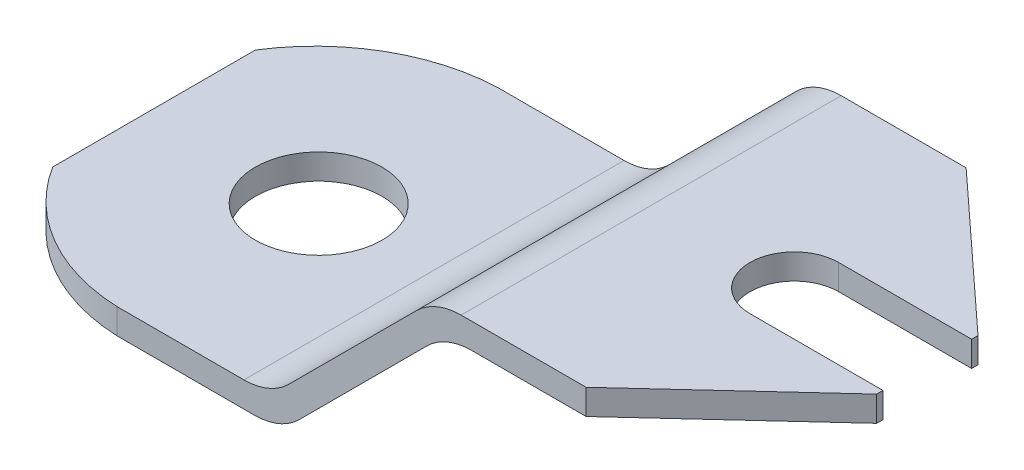
ISO-10303-21;
HEADER;
FILE_DESCRIPTION(('STEP AP214'),'2;1');
FILE_NAME('part.step','',(''),(''),'','','');
FILE_SCHEMA(('AUTOMOTIVE_DESIGN { 1 0 10303 214 1 1 1 1 }'));
ENDSEC;
DATA;
#1=APPLICATION_CONTEXT('core data for automotive mechanical design processes');
#2=APPLICATION_PROTOCOL_DEFINITION('international standard','automotive_design',2000,#1);
#3=PRODUCT_CONTEXT('',#1,'mechanical');
#4=PRODUCT('Part','Part','',(#3));
#5=PRODUCT_RELATED_PRODUCT_CATEGORY('part','',(#4));
#6=PRODUCT_DEFINITION_FORMATION('','',#4);
#7=PRODUCT_DEFINITION_CONTEXT('part definition',#1,'design');
#8=PRODUCT_DEFINITION('design','',#6,#7);
#9=PRODUCT_DEFINITION_SHAPE('','',#8);
#10=(LENGTH_UNIT() NAMED_UNIT(*) SI_UNIT(.MILLI.,.METRE.));
#11=(NAMED_UNIT(*) PLANE_ANGLE_UNIT() SI_UNIT($,.RADIAN.));
#12=(NAMED_UNIT(*) SI_UNIT($,.STERADIAN.) SOLID_ANGLE_UNIT());
#13=UNCERTAINTY_MEASURE_WITH_UNIT(LENGTH_MEASURE(1.E-05),#10,'distance_accuracy_value','');
#14=(GEOMETRIC_REPRESENTATION_CONTEXT(3) GLOBAL_UNCERTAINTY_ASSIGNED_CONTEXT((#13)) GLOBAL_UNIT_ASSIGNED_CONTEXT((#10,
#11,#12)) REPRESENTATION_CONTEXT('',''));
#15=CARTESIAN_POINT('',(0.,0.,0.));
#16=DIRECTION('',(0.,0.,1.));
#17=DIRECTION('',(1.,0.,0.));
#18=AXIS2_PLACEMENT_3D('',#15,#16,#17);
#19=CARTESIAN_POINT('',(0.,0.,30.));
#20=DIRECTION('',(0.,1.,0.));
#21=DIRECTION('',(0.,0.,1.));
#22=AXIS2_PLACEMENT_3D('',#19,#20,#21);
#23=PLANE('',#22);
#24=CARTESIAN_POINT('',(26.,0.,0.));
#25=DIRECTION('',(0.,1.,0.));
#26=DIRECTION('',(0.,0.,1.));
#27=AXIS2_PLACEMENT_3D('',#24,#25,#26);
#28=CIRCLE('',#27,10.);
#29=CARTESIAN_POINT('',(26.,0.,10.));
#30=VERTEX_POINT('',#29);
#31=EDGE_CURVE('E209',#30,#30,#28,.F.);
#32=ORIENTED_EDGE('',*,*,#31,.F.);
#33=EDGE_LOOP('',(#32));
#34=FACE_BOUND('',#33,.T.);
#35=DIRECTION('',(1.,0.,0.));
#36=VECTOR('',#35,1.);
#37=CARTESIAN_POINT('',(0.,0.,-30.));
#38=LINE('',#37,#36);
#39=CARTESIAN_POINT('',(24.1715728752538,0.,-30.));
#40=VERTEX_POINT('',#39);
#41=CARTESIAN_POINT('',(45.857864376269,0.,-30.));
#42=VERTEX_POINT('',#41);
#43=EDGE_CURVE('E266',#40,#42,#38,.T.);
#44=ORIENTED_EDGE('',*,*,#43,.T.);
#45=DIRECTION('',(0.,0.,-1.));
#46=VECTOR('',#45,1.);
#47=CARTESIAN_POINT('',(45.857864376269,0.,30.));
#48=LINE('',#47,#46);
#49=CARTESIAN_POINT('',(45.857864376269,0.,30.));
#50=VERTEX_POINT('',#49);
#51=EDGE_CURVE('E54',#42,#50,#48,.F.);
#52=ORIENTED_EDGE('',*,*,#51,.T.);
#53=DIRECTION('',(1.,0.,0.));
#54=VECTOR('',#53,1.);
#55=CARTESIAN_POINT('',(0.,0.,30.));
#56=LINE('',#55,#54);
#57=CARTESIAN_POINT('',(24.1715728752538,0.,30.));
#58=VERTEX_POINT('',#57);
#59=EDGE_CURVE('E191',#58,#50,#56,.T.);
#60=ORIENTED_EDGE('',*,*,#59,.F.);
#61=CARTESIAN_POINT('',(25.3928167857688,0.,0.0248675847623649));
#62=DIRECTION('',(0.,1.,0.));
#63=DIRECTION('',(0.,0.,-1.));
#64=AXIS2_PLACEMENT_3D('',#61,#62,#63);
#65=CIRCLE('',#64,30.);
#66=CARTESIAN_POINT('',(0.,0.,16.));
#67=VERTEX_POINT('',#66);
#68=EDGE_CURVE('E180',#67,#58,#65,.T.);
#69=ORIENTED_EDGE('',*,*,#68,.F.);
#70=DIRECTION('',(0.,0.,-1.));
#71=VECTOR('',#70,1.);
#72=CARTESIAN_POINT('',(0.,0.,30.));
#73=LINE('',#72,#71);
#74=CARTESIAN_POINT('',(0.,0.,-16.));
#75=VERTEX_POINT('',#74);
#76=EDGE_CURVE('E189',#67,#75,#73,.T.);
#77=ORIENTED_EDGE('',*,*,#76,.T.);
#78=CARTESIAN_POINT('',(25.3928167857688,0.,-0.0248675847623649));
#79=DIRECTION('',(0.,-1.,0.));
#80=DIRECTION('',(0.,0.,1.));
#81=AXIS2_PLACEMENT_3D('',#78,#79,#80);
#82=CIRCLE('',#81,30.);
#83=EDGE_CURVE('E399',#75,#40,#82,.T.);
#84=ORIENTED_EDGE('',*,*,#83,.T.);
#85=EDGE_LOOP('',(#44,#52,#60,#69,#77,#84));
#86=FACE_BOUND('',#85,.T.);
#87=ADVANCED_FACE('F39',(#34,#86),#23,.F.);
#88=CARTESIAN_POINT('',(0.,4.,30.));
#89=DIRECTION('',(0.,-1.,0.));
#90=DIRECTION('',(0.,0.,-1.));
#91=AXIS2_PLACEMENT_3D('',#88,#89,#90);
#92=PLANE('',#91);
#93=CARTESIAN_POINT('',(26.,4.,0.));
#94=DIRECTION('',(0.,-1.,0.));
#95=DIRECTION('',(0.,0.,-1.));
#96=AXIS2_PLACEMENT_3D('',#93,#94,#95);
#97=CIRCLE('',#96,10.);
#98=CARTESIAN_POINT('',(26.,4.,-10.));
#99=VERTEX_POINT('',#98);
#100=EDGE_CURVE('E207',#99,#99,#97,.F.);
#101=ORIENTED_EDGE('',*,*,#100,.F.);
#102=EDGE_LOOP('',(#101));
#103=FACE_BOUND('',#102,.T.);
#104=DIRECTION('',(-1.,0.,0.));
#105=VECTOR('',#104,1.);
#106=CARTESIAN_POINT('',(0.,4.,30.));
#107=LINE('',#106,#105);
#108=CARTESIAN_POINT('',(44.2010101267767,4.,30.));
#109=VERTEX_POINT('',#108);
#110=CARTESIAN_POINT('',(24.1715728752538,4.,30.));
#111=VERTEX_POINT('',#110);
#112=EDGE_CURVE('E291',#109,#111,#107,.T.);
#113=ORIENTED_EDGE('',*,*,#112,.F.);
#114=DIRECTION('',(0.,0.,-1.));
#115=VECTOR('',#114,1.);
#116=CARTESIAN_POINT('',(44.2010101267767,4.,-30.));
#117=LINE('',#116,#115);
#118=CARTESIAN_POINT('',(44.2010101267767,4.,-30.));
#119=VERTEX_POINT('',#118);
#120=EDGE_CURVE('E221',#109,#119,#117,.T.);
#121=ORIENTED_EDGE('',*,*,#120,.T.);
#122=DIRECTION('',(-1.,0.,0.));
#123=VECTOR('',#122,1.);
#124=CARTESIAN_POINT('',(0.,4.,-30.));
#125=LINE('',#124,#123);
#126=CARTESIAN_POINT('',(24.1715728752538,4.,-30.));
#127=VERTEX_POINT('',#126);
#128=EDGE_CURVE('E301',#119,#127,#125,.T.);
#129=ORIENTED_EDGE('',*,*,#128,.T.);
#130=CARTESIAN_POINT('',(25.3928167857688,4.,-0.0248675847623649));
#131=DIRECTION('',(0.,-1.,0.));
#132=DIRECTION('',(0.,0.,-1.));
#133=AXIS2_PLACEMENT_3D('',#130,#131,#132);
#134=CIRCLE('',#133,30.);
#135=CARTESIAN_POINT('',(0.,4.,-16.));
#136=VERTEX_POINT('',#135);
#137=EDGE_CURVE('E216',#136,#127,#134,.T.);
#138=ORIENTED_EDGE('',*,*,#137,.F.);
#139=DIRECTION('',(0.,0.,-1.));
#140=VECTOR('',#139,1.);
#141=CARTESIAN_POINT('',(0.,4.,30.));
#142=LINE('',#141,#140);
#143=CARTESIAN_POINT('',(0.,4.,16.));
#144=VERTEX_POINT('',#143);
#145=EDGE_CURVE('E293',#144,#136,#142,.T.);
#146=ORIENTED_EDGE('',*,*,#145,.F.);
#147=CARTESIAN_POINT('',(25.3928167857688,4.,0.0248675847623649));
#148=DIRECTION('',(0.,-1.,0.));
#149=DIRECTION('',(0.,0.,-1.));
#150=AXIS2_PLACEMENT_3D('',#147,#148,#149);
#151=CIRCLE('',#150,30.);
#152=EDGE_CURVE('E183',#144,#111,#151,.F.);
#153=ORIENTED_EDGE('',*,*,#152,.T.);
#154=EDGE_LOOP('',(#113,#121,#129,#138,#146,#153));
#155=FACE_BOUND('',#154,.T.);
#156=ADVANCED_FACE('F360',(#103,#155),#92,.F.);
#157=CARTESIAN_POINT('',(0.,0.,-30.));
#158=DIRECTION('',(0.,0.,-1.));
#159=DIRECTION('',(-1.,0.,0.));
#160=AXIS2_PLACEMENT_3D('',#157,#158,#159);
#161=PLANE('',#160);
#162=DIRECTION('',(0.707106781186547,0.707106781186548,0.));
#163=VECTOR('',#162,1.);
#164=CARTESIAN_POINT('',(50.,0.,-30.));
#165=LINE('',#164,#163);
#166=CARTESIAN_POINT('',(52.9289321881345,2.92893218813452,-30.));
#167=VERTEX_POINT('',#166);
#168=CARTESIAN_POINT('',(73.0710678118655,23.0710678118655,-30.));
#169=VERTEX_POINT('',#168);
#170=EDGE_CURVE('E255',#167,#169,#165,.T.);
#171=ORIENTED_EDGE('',*,*,#170,.F.);
#172=CARTESIAN_POINT('',(45.857864376269,10.,-30.));
#173=DIRECTION('',(0.,0.,-1.));
#174=DIRECTION('',(-1.,0.,0.));
#175=AXIS2_PLACEMENT_3D('',#172,#173,#174);
#176=CIRCLE('',#175,10.);
#177=EDGE_CURVE('E62',#167,#42,#176,.T.);
#178=ORIENTED_EDGE('',*,*,#177,.T.);
#179=ORIENTED_EDGE('',*,*,#43,.F.);
#180=DIRECTION('',(0.,-1.,0.));
#181=VECTOR('',#180,1.);
#182=CARTESIAN_POINT('',(24.1715728752538,30.,-30.));
#183=LINE('',#182,#181);
#184=EDGE_CURVE('E401',#127,#40,#183,.T.);
#185=ORIENTED_EDGE('',*,*,#184,.F.);
#186=ORIENTED_EDGE('',*,*,#128,.F.);
#187=CARTESIAN_POINT('',(44.2010101267767,14.,-30.));
#188=DIRECTION('',(0.,0.,-1.));
#189=DIRECTION('',(-1.,0.,0.));
#190=AXIS2_PLACEMENT_3D('',#187,#188,#189);
#191=CIRCLE('',#190,10.);
#192=CARTESIAN_POINT('',(51.2720779386422,6.92893218813453,-30.));
#193=VERTEX_POINT('',#192);
#194=EDGE_CURVE('E227',#119,#193,#191,.F.);
#195=ORIENTED_EDGE('',*,*,#194,.T.);
#196=DIRECTION('',(-0.707106781186547,-0.707106781186548,0.));
#197=VECTOR('',#196,1.);
#198=CARTESIAN_POINT('',(48.3431457505076,4.,-30.));
#199=LINE('',#198,#197);
#200=CARTESIAN_POINT('',(71.4142135623731,27.0710678118655,-30.));
#201=VERTEX_POINT('',#200);
#202=EDGE_CURVE('E299',#201,#193,#199,.T.);
#203=ORIENTED_EDGE('',*,*,#202,.F.);
#204=CARTESIAN_POINT('',(78.4852813742386,20.,-30.));
#205=DIRECTION('',(0.,0.,-1.));
#206=DIRECTION('',(-1.,0.,0.));
#207=AXIS2_PLACEMENT_3D('',#204,#205,#206);
#208=CIRCLE('',#207,10.);
#209=CARTESIAN_POINT('',(78.4852813742386,30.,-30.));
#210=VERTEX_POINT('',#209);
#211=EDGE_CURVE('E235',#201,#210,#208,.T.);
#212=ORIENTED_EDGE('',*,*,#211,.T.);
#213=DIRECTION('',(-1.,0.,0.));
#214=VECTOR('',#213,1.);
#215=CARTESIAN_POINT('',(74.3431457505076,30.,-30.));
#216=LINE('',#215,#214);
#217=CARTESIAN_POINT('',(98.2148375469132,30.,-30.));
#218=VERTEX_POINT('',#217);
#219=EDGE_CURVE('E296',#218,#210,#216,.T.);
#220=ORIENTED_EDGE('',*,*,#219,.F.);
#221=DIRECTION('',(0.,-1.,0.));
#222=VECTOR('',#221,1.);
#223=CARTESIAN_POINT('',(98.2148375469132,30.,-30.));
#224=LINE('',#223,#222);
#225=CARTESIAN_POINT('',(98.2148375469132,26.,-30.));
#226=VERTEX_POINT('',#225);
#227=EDGE_CURVE('E328',#218,#226,#224,.T.);
#228=ORIENTED_EDGE('',*,*,#227,.T.);
#229=DIRECTION('',(1.,0.,0.));
#230=VECTOR('',#229,1.);
#231=CARTESIAN_POINT('',(76.,26.,-30.));
#232=LINE('',#231,#230);
#233=CARTESIAN_POINT('',(80.142135623731,26.,-30.));
#234=VERTEX_POINT('',#233);
#235=EDGE_CURVE('E257',#234,#226,#232,.T.);
#236=ORIENTED_EDGE('',*,*,#235,.F.);
#237=CARTESIAN_POINT('',(80.142135623731,16.,-30.));
#238=DIRECTION('',(0.,0.,-1.));
#239=DIRECTION('',(-1.,0.,0.));
#240=AXIS2_PLACEMENT_3D('',#237,#238,#239);
#241=CIRCLE('',#240,10.);
#242=EDGE_CURVE('E47',#234,#169,#241,.F.);
#243=ORIENTED_EDGE('',*,*,#242,.T.);
#244=EDGE_LOOP('',(#171,#178,#179,#185,#186,#195,#203,#212,#220,#228,#236,#243));
#245=FACE_BOUND('',#244,.T.);
#246=ADVANCED_FACE('F254',(#245),#161,.T.);
#247=CARTESIAN_POINT('',(0.,0.,30.));
#248=DIRECTION('',(1.,0.,0.));
#249=DIRECTION('',(0.,0.,-1.));
#250=AXIS2_PLACEMENT_3D('',#247,#248,#249);
#251=PLANE('',#250);
#252=ORIENTED_EDGE('',*,*,#76,.F.);
#253=DIRECTION('',(0.,-1.,0.));
#254=VECTOR('',#253,1.);
#255=CARTESIAN_POINT('',(0.,30.,16.));
#256=LINE('',#255,#254);
#257=EDGE_CURVE('E176',#144,#67,#256,.T.);
#258=ORIENTED_EDGE('',*,*,#257,.F.);
#259=ORIENTED_EDGE('',*,*,#145,.T.);
#260=DIRECTION('',(0.,-1.,0.));
#261=VECTOR('',#260,1.);
#262=CARTESIAN_POINT('',(0.,30.,-16.));
#263=LINE('',#262,#261);
#264=EDGE_CURVE('E196',#136,#75,#263,.T.);
#265=ORIENTED_EDGE('',*,*,#264,.T.);
#266=EDGE_LOOP('',(#252,#258,#259,#265));
#267=FACE_BOUND('',#266,.T.);
#268=ADVANCED_FACE('F194',(#267),#251,.F.);
#269=CARTESIAN_POINT('',(76.,26.,30.));
#270=DIRECTION('',(0.,1.,0.));
#271=DIRECTION('',(0.,0.,1.));
#272=AXIS2_PLACEMENT_3D('',#269,#270,#271);
#273=PLANE('',#272);
#274=DIRECTION('',(1.,0.,0.));
#275=VECTOR('',#274,1.);
#276=CARTESIAN_POINT('',(76.,26.,30.));
#277=LINE('',#276,#275);
#278=CARTESIAN_POINT('',(80.142135623731,26.,30.));
#279=VERTEX_POINT('',#278);
#280=CARTESIAN_POINT('',(98.2148375469132,26.,30.));
#281=VERTEX_POINT('',#280);
#282=EDGE_CURVE('E274',#279,#281,#277,.T.);
#283=ORIENTED_EDGE('',*,*,#282,.F.);
#284=DIRECTION('',(0.,0.,-1.));
#285=VECTOR('',#284,1.);
#286=CARTESIAN_POINT('',(80.142135623731,26.,-30.));
#287=LINE('',#286,#285);
#288=EDGE_CURVE('E241',#279,#234,#287,.T.);
#289=ORIENTED_EDGE('',*,*,#288,.T.);
#290=ORIENTED_EDGE('',*,*,#235,.T.);
#291=DIRECTION('',(-0.735346819804324,0.,-0.677690972791926));
#292=VECTOR('',#291,1.);
#293=CARTESIAN_POINT('',(116.102772678153,26.,-13.514592252463));
#294=LINE('',#293,#292);
#295=CARTESIAN_POINT('',(122.086529343319,26.,-8.));
#296=VERTEX_POINT('',#295);
#297=EDGE_CURVE('E330',#296,#226,#294,.T.);
#298=ORIENTED_EDGE('',*,*,#297,.F.);
#299=DIRECTION('',(0.,0.,-1.));
#300=VECTOR('',#299,1.);
#301=CARTESIAN_POINT('',(122.086529343319,26.,30.));
#302=LINE('',#301,#300);
#303=CARTESIAN_POINT('',(122.086529343319,26.,-7.));
#304=VERTEX_POINT('',#303);
#305=EDGE_CURVE('E203',#304,#296,#302,.T.);
#306=ORIENTED_EDGE('',*,*,#305,.F.);
#307=DIRECTION('',(1.,0.,0.));
#308=VECTOR('',#307,1.);
#309=CARTESIAN_POINT('',(76.,26.,-7.));
#310=LINE('',#309,#308);
#311=CARTESIAN_POINT('',(101.086529343319,26.,-7.));
#312=VERTEX_POINT('',#311);
#313=EDGE_CURVE('E210',#312,#304,#310,.T.);
#314=ORIENTED_EDGE('',*,*,#313,.F.);
#315=CARTESIAN_POINT('',(101.086529343319,26.,0.));
#316=DIRECTION('',(0.,1.,0.));
#317=DIRECTION('',(0.,0.,1.));
#318=AXIS2_PLACEMENT_3D('',#315,#316,#317);
#319=CIRCLE('',#318,7.);
#320=CARTESIAN_POINT('',(101.086529343319,26.,7.));
#321=VERTEX_POINT('',#320);
#322=EDGE_CURVE('E348',#321,#312,#319,.F.);
#323=ORIENTED_EDGE('',*,*,#322,.F.);
#324=DIRECTION('',(-1.,0.,0.));
#325=VECTOR('',#324,1.);
#326=CARTESIAN_POINT('',(76.,26.,7.00000000000001));
#327=LINE('',#326,#325);
#328=CARTESIAN_POINT('',(122.086529343319,26.,7.));
#329=VERTEX_POINT('',#328);
#330=EDGE_CURVE('E346',#329,#321,#327,.T.);
#331=ORIENTED_EDGE('',*,*,#330,.F.);
#332=CARTESIAN_POINT('',(122.086529343319,26.,8.));
#333=VERTEX_POINT('',#332);
#334=EDGE_CURVE('E198',#333,#329,#302,.T.);
#335=ORIENTED_EDGE('',*,*,#334,.F.);
#336=DIRECTION('',(-0.735346819804324,0.,0.677690972791926));
#337=VECTOR('',#336,1.);
#338=CARTESIAN_POINT('',(86.2024985789947,26.,41.070495528683));
#339=LINE('',#338,#337);
#340=EDGE_CURVE('E281',#333,#281,#339,.T.);
#341=ORIENTED_EDGE('',*,*,#340,.T.);
#342=EDGE_LOOP('',(#283,#289,#290,#298,#306,#314,#323,#331,#335,#341));
#343=FACE_BOUND('',#342,.T.);
#344=ADVANCED_FACE('F279',(#343),#273,.F.);
#345=CARTESIAN_POINT('',(122.086529343319,30.,30.));
#346=DIRECTION('',(-1.,0.,0.));
#347=DIRECTION('',(0.,-1.,0.));
#348=AXIS2_PLACEMENT_3D('',#345,#346,#347);
#349=PLANE('',#348);
#350=DIRECTION('',(0.,-1.,0.));
#351=VECTOR('',#350,1.);
#352=CARTESIAN_POINT('',(122.086529343319,30.,-8.));
#353=LINE('',#352,#351);
#354=CARTESIAN_POINT('',(122.086529343319,30.,-8.));
#355=VERTEX_POINT('',#354);
#356=EDGE_CURVE('E324',#355,#296,#353,.T.);
#357=ORIENTED_EDGE('',*,*,#356,.F.);
#358=DIRECTION('',(0.,0.,-1.));
#359=VECTOR('',#358,1.);
#360=CARTESIAN_POINT('',(122.086529343319,30.,30.));
#361=LINE('',#360,#359);
#362=CARTESIAN_POINT('',(122.086529343319,30.,-7.));
#363=VERTEX_POINT('',#362);
#364=EDGE_CURVE('E303',#363,#355,#361,.T.);
#365=ORIENTED_EDGE('',*,*,#364,.F.);
#366=DIRECTION('',(0.,-1.,0.));
#367=VECTOR('',#366,1.);
#368=CARTESIAN_POINT('',(122.086529343319,90.,-7.));
#369=LINE('',#368,#367);
#370=EDGE_CURVE('E322',#363,#304,#369,.T.);
#371=ORIENTED_EDGE('',*,*,#370,.T.);
#372=ORIENTED_EDGE('',*,*,#305,.T.);
#373=EDGE_LOOP('',(#357,#365,#371,#372));
#374=FACE_BOUND('',#373,.T.);
#375=ADVANCED_FACE('F321',(#374),#349,.F.);
#376=CARTESIAN_POINT('',(74.3431457505076,30.,30.));
#377=DIRECTION('',(0.,-1.,0.));
#378=DIRECTION('',(0.,0.,-1.));
#379=AXIS2_PLACEMENT_3D('',#376,#377,#378);
#380=PLANE('',#379);
#381=ORIENTED_EDGE('',*,*,#219,.T.);
#382=DIRECTION('',(0.,0.,-1.));
#383=VECTOR('',#382,1.);
#384=CARTESIAN_POINT('',(78.4852813742386,30.,30.));
#385=LINE('',#384,#383);
#386=CARTESIAN_POINT('',(78.4852813742386,30.,30.));
#387=VERTEX_POINT('',#386);
#388=EDGE_CURVE('E237',#210,#387,#385,.F.);
#389=ORIENTED_EDGE('',*,*,#388,.T.);
#390=DIRECTION('',(-1.,0.,0.));
#391=VECTOR('',#390,1.);
#392=CARTESIAN_POINT('',(74.3431457505076,30.,30.));
#393=LINE('',#392,#391);
#394=CARTESIAN_POINT('',(98.2148375469132,30.,30.));
#395=VERTEX_POINT('',#394);
#396=EDGE_CURVE('E282',#395,#387,#393,.T.);
#397=ORIENTED_EDGE('',*,*,#396,.F.);
#398=DIRECTION('',(0.735346819804324,0.,-0.677690972791926));
#399=VECTOR('',#398,1.);
#400=CARTESIAN_POINT('',(98.2148375469132,30.,30.));
#401=LINE('',#400,#399);
#402=CARTESIAN_POINT('',(122.086529343319,30.,8.));
#403=VERTEX_POINT('',#402);
#404=EDGE_CURVE('E406',#395,#403,#401,.T.);
#405=ORIENTED_EDGE('',*,*,#404,.T.);
#406=CARTESIAN_POINT('',(122.086529343319,30.,7.));
#407=VERTEX_POINT('',#406);
#408=EDGE_CURVE('E304',#403,#407,#361,.T.);
#409=ORIENTED_EDGE('',*,*,#408,.T.);
#410=DIRECTION('',(1.,0.,0.));
#411=VECTOR('',#410,1.);
#412=CARTESIAN_POINT('',(74.3431457505076,30.,7.00000000000001));
#413=LINE('',#412,#411);
#414=CARTESIAN_POINT('',(101.086529343319,30.,7.));
#415=VERTEX_POINT('',#414);
#416=EDGE_CURVE('E197',#415,#407,#413,.T.);
#417=ORIENTED_EDGE('',*,*,#416,.F.);
#418=CARTESIAN_POINT('',(101.086529343319,30.,0.));
#419=DIRECTION('',(0.,-1.,0.));
#420=DIRECTION('',(0.,0.,-1.));
#421=AXIS2_PLACEMENT_3D('',#418,#419,#420);
#422=CIRCLE('',#421,7.);
#423=CARTESIAN_POINT('',(101.086529343319,30.,-7.));
#424=VERTEX_POINT('',#423);
#425=EDGE_CURVE('E201',#424,#415,#422,.F.);
#426=ORIENTED_EDGE('',*,*,#425,.F.);
#427=DIRECTION('',(-1.,0.,0.));
#428=VECTOR('',#427,1.);
#429=CARTESIAN_POINT('',(74.3431457505076,30.,-7.));
#430=LINE('',#429,#428);
#431=EDGE_CURVE('E214',#363,#424,#430,.T.);
#432=ORIENTED_EDGE('',*,*,#431,.F.);
#433=ORIENTED_EDGE('',*,*,#364,.T.);
#434=DIRECTION('',(0.735346819804324,0.,0.677690972791926));
#435=VECTOR('',#434,1.);
#436=CARTESIAN_POINT('',(98.2148375469132,30.,-30.));
#437=LINE('',#436,#435);
#438=EDGE_CURVE('E315',#218,#355,#437,.T.);
#439=ORIENTED_EDGE('',*,*,#438,.F.);
#440=EDGE_LOOP('',(#381,#389,#397,#405,#409,#417,#426,#432,#433,#439));
#441=FACE_BOUND('',#440,.T.);
#442=ADVANCED_FACE('F314',(#441),#380,.F.);
#443=ORIENTED_EDGE('',*,*,#408,.F.);
#444=DIRECTION('',(0.,-1.,0.));
#445=VECTOR('',#444,1.);
#446=CARTESIAN_POINT('',(122.086529343319,30.,8.));
#447=LINE('',#446,#445);
#448=EDGE_CURVE('E410',#403,#333,#447,.T.);
#449=ORIENTED_EDGE('',*,*,#448,.T.);
#450=ORIENTED_EDGE('',*,*,#334,.T.);
#451=DIRECTION('',(0.,-1.,0.));
#452=VECTOR('',#451,1.);
#453=CARTESIAN_POINT('',(122.086529343319,90.,7.));
#454=LINE('',#453,#452);
#455=EDGE_CURVE('E336',#407,#329,#454,.T.);
#456=ORIENTED_EDGE('',*,*,#455,.F.);
#457=EDGE_LOOP('',(#443,#449,#450,#456));
#458=FACE_BOUND('',#457,.T.);
#459=ADVANCED_FACE('F413',(#458),#349,.F.);
#460=CARTESIAN_POINT('',(50.,0.,30.));
#461=DIRECTION('',(-0.707106781186548,0.707106781186547,0.));
#462=DIRECTION('',(-0.707106781186547,-0.707106781186548,0.));
#463=AXIS2_PLACEMENT_3D('',#460,#461,#462);
#464=PLANE('',#463);
#465=ORIENTED_EDGE('',*,*,#170,.T.);
#466=DIRECTION('',(0.,0.,-1.));
#467=VECTOR('',#466,1.);
#468=CARTESIAN_POINT('',(73.0710678118655,23.0710678118655,30.));
#469=LINE('',#468,#467);
#470=CARTESIAN_POINT('',(73.0710678118655,23.0710678118655,30.));
#471=VERTEX_POINT('',#470);
#472=EDGE_CURVE('E247',#169,#471,#469,.F.);
#473=ORIENTED_EDGE('',*,*,#472,.T.);
#474=DIRECTION('',(0.707106781186547,0.707106781186548,0.));
#475=VECTOR('',#474,1.);
#476=CARTESIAN_POINT('',(50.,0.,30.));
#477=LINE('',#476,#475);
#478=CARTESIAN_POINT('',(52.9289321881345,2.92893218813452,30.));
#479=VERTEX_POINT('',#478);
#480=EDGE_CURVE('E276',#479,#471,#477,.T.);
#481=ORIENTED_EDGE('',*,*,#480,.F.);
#482=DIRECTION('',(0.,0.,-1.));
#483=VECTOR('',#482,1.);
#484=CARTESIAN_POINT('',(52.9289321881345,2.92893218813452,30.));
#485=LINE('',#484,#483);
#486=EDGE_CURVE('E244',#479,#167,#485,.T.);
#487=ORIENTED_EDGE('',*,*,#486,.T.);
#488=EDGE_LOOP('',(#465,#473,#481,#487));
#489=FACE_BOUND('',#488,.T.);
#490=ADVANCED_FACE('F262',(#489),#464,.F.);
#491=CARTESIAN_POINT('',(48.3431457505076,4.,30.));
#492=DIRECTION('',(0.707106781186548,-0.707106781186547,0.));
#493=DIRECTION('',(0.707106781186547,0.707106781186548,0.));
#494=AXIS2_PLACEMENT_3D('',#491,#492,#493);
#495=PLANE('',#494);
#496=DIRECTION('',(-0.707106781186547,-0.707106781186548,0.));
#497=VECTOR('',#496,1.);
#498=CARTESIAN_POINT('',(48.3431457505076,4.,30.));
#499=LINE('',#498,#497);
#500=CARTESIAN_POINT('',(71.4142135623731,27.0710678118655,30.));
#501=VERTEX_POINT('',#500);
#502=CARTESIAN_POINT('',(51.2720779386422,6.92893218813453,30.));
#503=VERTEX_POINT('',#502);
#504=EDGE_CURVE('E285',#501,#503,#499,.T.);
#505=ORIENTED_EDGE('',*,*,#504,.F.);
#506=DIRECTION('',(0.,0.,-1.));
#507=VECTOR('',#506,1.);
#508=CARTESIAN_POINT('',(71.4142135623731,27.0710678118655,30.));
#509=LINE('',#508,#507);
#510=EDGE_CURVE('E232',#501,#201,#509,.T.);
#511=ORIENTED_EDGE('',*,*,#510,.T.);
#512=ORIENTED_EDGE('',*,*,#202,.T.);
#513=DIRECTION('',(0.,0.,-1.));
#514=VECTOR('',#513,1.);
#515=CARTESIAN_POINT('',(51.2720779386422,6.92893218813453,30.));
#516=LINE('',#515,#514);
#517=EDGE_CURVE('E224',#193,#503,#516,.F.);
#518=ORIENTED_EDGE('',*,*,#517,.T.);
#519=EDGE_LOOP('',(#505,#511,#512,#518));
#520=FACE_BOUND('',#519,.T.);
#521=ADVANCED_FACE('F390',(#520),#495,.F.);
#522=CARTESIAN_POINT('',(0.,0.,30.));
#523=DIRECTION('',(0.,0.,-1.));
#524=DIRECTION('',(-1.,0.,0.));
#525=AXIS2_PLACEMENT_3D('',#522,#523,#524);
#526=PLANE('',#525);
#527=ORIENTED_EDGE('',*,*,#59,.T.);
#528=CARTESIAN_POINT('',(45.857864376269,10.,30.));
#529=DIRECTION('',(0.,0.,-1.));
#530=DIRECTION('',(-1.,0.,0.));
#531=AXIS2_PLACEMENT_3D('',#528,#529,#530);
#532=CIRCLE('',#531,10.);
#533=EDGE_CURVE('E251',#50,#479,#532,.F.);
#534=ORIENTED_EDGE('',*,*,#533,.T.);
#535=ORIENTED_EDGE('',*,*,#480,.T.);
#536=CARTESIAN_POINT('',(80.142135623731,16.,30.));
#537=DIRECTION('',(0.,0.,-1.));
#538=DIRECTION('',(-1.,0.,0.));
#539=AXIS2_PLACEMENT_3D('',#536,#537,#538);
#540=CIRCLE('',#539,10.);
#541=EDGE_CURVE('E11',#471,#279,#540,.T.);
#542=ORIENTED_EDGE('',*,*,#541,.T.);
#543=ORIENTED_EDGE('',*,*,#282,.T.);
#544=DIRECTION('',(0.,-1.,0.));
#545=VECTOR('',#544,1.);
#546=CARTESIAN_POINT('',(98.2148375469132,30.,30.));
#547=LINE('',#546,#545);
#548=EDGE_CURVE('E408',#395,#281,#547,.T.);
#549=ORIENTED_EDGE('',*,*,#548,.F.);
#550=ORIENTED_EDGE('',*,*,#396,.T.);
#551=CARTESIAN_POINT('',(78.4852813742386,20.,30.));
#552=DIRECTION('',(0.,0.,-1.));
#553=DIRECTION('',(-1.,0.,0.));
#554=AXIS2_PLACEMENT_3D('',#551,#552,#553);
#555=CIRCLE('',#554,10.);
#556=EDGE_CURVE('E239',#387,#501,#555,.F.);
#557=ORIENTED_EDGE('',*,*,#556,.T.);
#558=ORIENTED_EDGE('',*,*,#504,.T.);
#559=CARTESIAN_POINT('',(44.2010101267767,14.,30.));
#560=DIRECTION('',(0.,0.,-1.));
#561=DIRECTION('',(-1.,0.,0.));
#562=AXIS2_PLACEMENT_3D('',#559,#560,#561);
#563=CIRCLE('',#562,10.);
#564=EDGE_CURVE('E230',#503,#109,#563,.T.);
#565=ORIENTED_EDGE('',*,*,#564,.T.);
#566=ORIENTED_EDGE('',*,*,#112,.T.);
#567=DIRECTION('',(0.,-1.,0.));
#568=VECTOR('',#567,1.);
#569=CARTESIAN_POINT('',(24.1715728752538,30.,30.));
#570=LINE('',#569,#568);
#571=EDGE_CURVE('E219',#111,#58,#570,.T.);
#572=ORIENTED_EDGE('',*,*,#571,.T.);
#573=EDGE_LOOP('',(#527,#534,#535,#542,#543,#549,#550,#557,#558,#565,#566,#572));
#574=FACE_BOUND('',#573,.T.);
#575=ADVANCED_FACE('F272',(#574),#526,.F.);
#576=CARTESIAN_POINT('',(26.,32.,0.));
#577=DIRECTION('',(0.,-1.,0.));
#578=DIRECTION('',(0.,0.,-1.));
#579=AXIS2_PLACEMENT_3D('',#576,#577,#578);
#580=CYLINDRICAL_SURFACE('',#579,10.);
#581=ORIENTED_EDGE('',*,*,#100,.T.);
#582=EDGE_LOOP('',(#581));
#583=FACE_BOUND('',#582,.T.);
#584=ORIENTED_EDGE('',*,*,#31,.T.);
#585=EDGE_LOOP('',(#584));
#586=FACE_BOUND('',#585,.T.);
#587=ADVANCED_FACE('F447',(#583,#586),#580,.F.);
#588=CARTESIAN_POINT('',(122.086529343319,90.,-7.));
#589=DIRECTION('',(0.,0.,1.));
#590=DIRECTION('',(1.,0.,0.));
#591=AXIS2_PLACEMENT_3D('',#588,#589,#590);
#592=PLANE('',#591);
#593=ORIENTED_EDGE('',*,*,#313,.T.);
#594=ORIENTED_EDGE('',*,*,#370,.F.);
#595=ORIENTED_EDGE('',*,*,#431,.T.);
#596=DIRECTION('',(0.,-1.,0.));
#597=VECTOR('',#596,1.);
#598=CARTESIAN_POINT('',(101.086529343319,90.,-7.));
#599=LINE('',#598,#597);
#600=EDGE_CURVE('E342',#424,#312,#599,.T.);
#601=ORIENTED_EDGE('',*,*,#600,.T.);
#602=EDGE_LOOP('',(#593,#594,#595,#601));
#603=FACE_BOUND('',#602,.T.);
#604=ADVANCED_FACE('F425',(#603),#592,.T.);
#605=CARTESIAN_POINT('',(101.086529343319,90.,0.));
#606=DIRECTION('',(0.,-1.,0.));
#607=DIRECTION('',(0.,0.,-1.));
#608=AXIS2_PLACEMENT_3D('',#605,#606,#607);
#609=CYLINDRICAL_SURFACE('',#608,7.);
#610=ORIENTED_EDGE('',*,*,#322,.T.);
#611=ORIENTED_EDGE('',*,*,#600,.F.);
#612=ORIENTED_EDGE('',*,*,#425,.T.);
#613=DIRECTION('',(0.,-1.,0.));
#614=VECTOR('',#613,1.);
#615=CARTESIAN_POINT('',(101.086529343319,90.,7.));
#616=LINE('',#615,#614);
#617=EDGE_CURVE('E339',#415,#321,#616,.T.);
#618=ORIENTED_EDGE('',*,*,#617,.T.);
#619=EDGE_LOOP('',(#610,#611,#612,#618));
#620=FACE_BOUND('',#619,.T.);
#621=ADVANCED_FACE('F422',(#620),#609,.F.);
#622=CARTESIAN_POINT('',(122.086529343319,90.,7.));
#623=DIRECTION('',(0.,0.,-1.));
#624=DIRECTION('',(-1.,0.,0.));
#625=AXIS2_PLACEMENT_3D('',#622,#623,#624);
#626=PLANE('',#625);
#627=ORIENTED_EDGE('',*,*,#330,.T.);
#628=ORIENTED_EDGE('',*,*,#617,.F.);
#629=ORIENTED_EDGE('',*,*,#416,.T.);
#630=ORIENTED_EDGE('',*,*,#455,.T.);
#631=EDGE_LOOP('',(#627,#628,#629,#630));
#632=FACE_BOUND('',#631,.T.);
#633=ADVANCED_FACE('F420',(#632),#626,.T.);
#634=CARTESIAN_POINT('',(98.2148375469132,30.,-30.));
#635=DIRECTION('',(0.677690972791926,0.,-0.735346819804324));
#636=DIRECTION('',(-0.735346819804324,0.,-0.677690972791926));
#637=AXIS2_PLACEMENT_3D('',#634,#635,#636);
#638=PLANE('',#637);
#639=ORIENTED_EDGE('',*,*,#297,.T.);
#640=ORIENTED_EDGE('',*,*,#227,.F.);
#641=ORIENTED_EDGE('',*,*,#438,.T.);
#642=ORIENTED_EDGE('',*,*,#356,.T.);
#643=EDGE_LOOP('',(#639,#640,#641,#642));
#644=FACE_BOUND('',#643,.T.);
#645=ADVANCED_FACE('F426',(#644),#638,.T.);
#646=CARTESIAN_POINT('',(98.2148375469132,30.,30.));
#647=DIRECTION('',(-0.677690972791926,0.,-0.735346819804324));
#648=DIRECTION('',(-0.735346819804324,0.,0.677690972791926));
#649=AXIS2_PLACEMENT_3D('',#646,#647,#648);
#650=PLANE('',#649);
#651=ORIENTED_EDGE('',*,*,#448,.F.);
#652=ORIENTED_EDGE('',*,*,#404,.F.);
#653=ORIENTED_EDGE('',*,*,#548,.T.);
#654=ORIENTED_EDGE('',*,*,#340,.F.);
#655=EDGE_LOOP('',(#651,#652,#653,#654));
#656=FACE_BOUND('',#655,.T.);
#657=ADVANCED_FACE('F427',(#656),#650,.F.);
#658=CARTESIAN_POINT('',(25.3928167857688,30.,-0.0248675847623649));
#659=DIRECTION('',(0.,-1.,0.));
#660=DIRECTION('',(0.,0.,-1.));
#661=AXIS2_PLACEMENT_3D('',#658,#659,#660);
#662=CYLINDRICAL_SURFACE('',#661,30.);
#663=ORIENTED_EDGE('',*,*,#137,.T.);
#664=ORIENTED_EDGE('',*,*,#184,.T.);
#665=ORIENTED_EDGE('',*,*,#83,.F.);
#666=ORIENTED_EDGE('',*,*,#264,.F.);
#667=EDGE_LOOP('',(#663,#664,#665,#666));
#668=FACE_BOUND('',#667,.T.);
#669=ADVANCED_FACE('F429',(#668),#662,.T.);
#670=CARTESIAN_POINT('',(25.3928167857688,30.,0.0248675847623649));
#671=DIRECTION('',(0.,-1.,0.));
#672=DIRECTION('',(0.,0.,-1.));
#673=AXIS2_PLACEMENT_3D('',#670,#671,#672);
#674=CYLINDRICAL_SURFACE('',#673,30.);
#675=ORIENTED_EDGE('',*,*,#257,.T.);
#676=ORIENTED_EDGE('',*,*,#68,.T.);
#677=ORIENTED_EDGE('',*,*,#571,.F.);
#678=ORIENTED_EDGE('',*,*,#152,.F.);
#679=EDGE_LOOP('',(#675,#676,#677,#678));
#680=FACE_BOUND('',#679,.T.);
#681=ADVANCED_FACE('F178',(#680),#674,.T.);
#682=CARTESIAN_POINT('',(44.2010101267767,14.,30.));
#683=DIRECTION('',(0.,0.,1.));
#684=DIRECTION('',(1.,0.,0.));
#685=AXIS2_PLACEMENT_3D('',#682,#683,#684);
#686=CYLINDRICAL_SURFACE('',#685,10.);
#687=ORIENTED_EDGE('',*,*,#564,.F.);
#688=ORIENTED_EDGE('',*,*,#517,.F.);
#689=ORIENTED_EDGE('',*,*,#194,.F.);
#690=ORIENTED_EDGE('',*,*,#120,.F.);
#691=EDGE_LOOP('',(#687,#688,#689,#690));
#692=FACE_BOUND('',#691,.T.);
#693=ADVANCED_FACE('F376',(#692),#686,.F.);
#694=CARTESIAN_POINT('',(78.4852813742386,20.,30.));
#695=DIRECTION('',(0.,0.,-1.));
#696=DIRECTION('',(-1.,0.,0.));
#697=AXIS2_PLACEMENT_3D('',#694,#695,#696);
#698=CYLINDRICAL_SURFACE('',#697,10.);
#699=ORIENTED_EDGE('',*,*,#556,.F.);
#700=ORIENTED_EDGE('',*,*,#388,.F.);
#701=ORIENTED_EDGE('',*,*,#211,.F.);
#702=ORIENTED_EDGE('',*,*,#510,.F.);
#703=EDGE_LOOP('',(#699,#700,#701,#702));
#704=FACE_BOUND('',#703,.T.);
#705=ADVANCED_FACE('F358',(#704),#698,.T.);
#706=CARTESIAN_POINT('',(80.142135623731,16.,30.));
#707=DIRECTION('',(0.,0.,1.));
#708=DIRECTION('',(1.,0.,0.));
#709=AXIS2_PLACEMENT_3D('',#706,#707,#708);
#710=CYLINDRICAL_SURFACE('',#709,10.);
#711=ORIENTED_EDGE('',*,*,#541,.F.);
#712=ORIENTED_EDGE('',*,*,#472,.F.);
#713=ORIENTED_EDGE('',*,*,#242,.F.);
#714=ORIENTED_EDGE('',*,*,#288,.F.);
#715=EDGE_LOOP('',(#711,#712,#713,#714));
#716=FACE_BOUND('',#715,.T.);
#717=ADVANCED_FACE('F269',(#716),#710,.F.);
#718=CARTESIAN_POINT('',(45.857864376269,10.,30.));
#719=DIRECTION('',(0.,0.,-1.));
#720=DIRECTION('',(-1.,0.,0.));
#721=AXIS2_PLACEMENT_3D('',#718,#719,#720);
#722=CYLINDRICAL_SURFACE('',#721,10.);
#723=ORIENTED_EDGE('',*,*,#533,.F.);
#724=ORIENTED_EDGE('',*,*,#51,.F.);
#725=ORIENTED_EDGE('',*,*,#177,.F.);
#726=ORIENTED_EDGE('',*,*,#486,.F.);
#727=EDGE_LOOP('',(#723,#724,#725,#726));
#728=FACE_BOUND('',#727,.T.);
#729=ADVANCED_FACE('F41',(#728),#722,.T.);
#730=CLOSED_SHELL('',(#87,#156,#246,#268,#344,#375,#442,#459,#490,#521,#575,#587,#604,#621,#633,
#645,#657,#669,#681,#693,#705,#717,#729));
#731=MANIFOLD_SOLID_BREP('B2',#730);
#732=ADVANCED_BREP_SHAPE_REPRESENTATION('',(#18,#731),#14);
#733=SHAPE_DEFINITION_REPRESENTATION(#9,#732);
ENDSEC;
END-ISO-10303-21;
